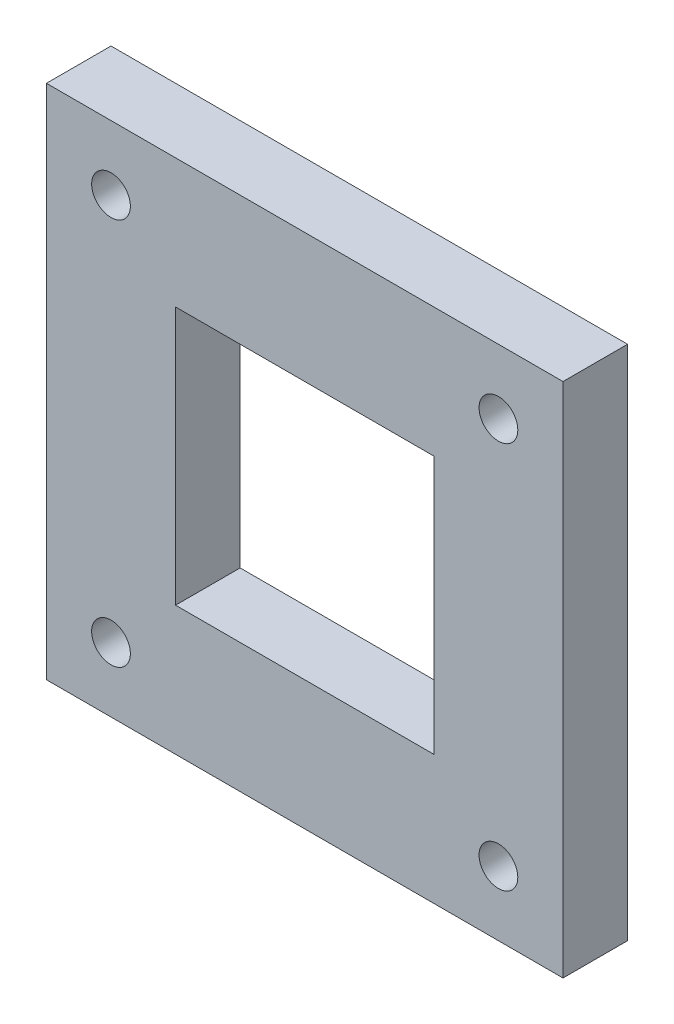
ISO-10303-21;
HEADER;
FILE_DESCRIPTION(('STEP AP214'),'2;1');
FILE_NAME('part.step','',(''),(''),'','','');
FILE_SCHEMA(('AUTOMOTIVE_DESIGN { 1 0 10303 214 1 1 1 1 }'));
ENDSEC;
DATA;
#1=APPLICATION_CONTEXT('core data for automotive mechanical design processes');
#2=APPLICATION_PROTOCOL_DEFINITION('international standard','automotive_design',2000,#1);
#3=PRODUCT_CONTEXT('',#1,'mechanical');
#4=PRODUCT('Part','Part','',(#3));
#5=PRODUCT_RELATED_PRODUCT_CATEGORY('part','',(#4));
#6=PRODUCT_DEFINITION_FORMATION('','',#4);
#7=PRODUCT_DEFINITION_CONTEXT('part definition',#1,'design');
#8=PRODUCT_DEFINITION('design','',#6,#7);
#9=PRODUCT_DEFINITION_SHAPE('','',#8);
#10=(LENGTH_UNIT() NAMED_UNIT(*) SI_UNIT(.MILLI.,.METRE.));
#11=(NAMED_UNIT(*) PLANE_ANGLE_UNIT() SI_UNIT($,.RADIAN.));
#12=(NAMED_UNIT(*) SI_UNIT($,.STERADIAN.) SOLID_ANGLE_UNIT());
#13=UNCERTAINTY_MEASURE_WITH_UNIT(LENGTH_MEASURE(1.E-05),#10,'distance_accuracy_value','');
#14=(GEOMETRIC_REPRESENTATION_CONTEXT(3) GLOBAL_UNCERTAINTY_ASSIGNED_CONTEXT((#13)) GLOBAL_UNIT_ASSIGNED_CONTEXT((#10,
#11,#12)) REPRESENTATION_CONTEXT('',''));
#15=CARTESIAN_POINT('',(0.,0.,0.));
#16=DIRECTION('',(0.,0.,1.));
#17=DIRECTION('',(1.,0.,0.));
#18=AXIS2_PLACEMENT_3D('',#15,#16,#17);
#19=CARTESIAN_POINT('',(20.,0.,5.));
#20=DIRECTION('',(-1.,0.,0.));
#21=DIRECTION('',(0.,0.,1.));
#22=AXIS2_PLACEMENT_3D('',#19,#20,#21);
#23=PLANE('',#22);
#24=DIRECTION('',(0.,1.,0.));
#25=VECTOR('',#24,1.);
#26=CARTESIAN_POINT('',(20.,0.,0.));
#27=LINE('',#26,#25);
#28=CARTESIAN_POINT('',(20.,-20.,0.));
#29=VERTEX_POINT('',#28);
#30=CARTESIAN_POINT('',(20.,20.,0.));
#31=VERTEX_POINT('',#30);
#32=EDGE_CURVE('E175',#29,#31,#27,.T.);
#33=ORIENTED_EDGE('',*,*,#32,.T.);
#34=DIRECTION('',(0.,0.,-1.));
#35=VECTOR('',#34,1.);
#36=CARTESIAN_POINT('',(20.,20.,5.));
#37=LINE('',#36,#35);
#38=CARTESIAN_POINT('',(20.,20.,5.));
#39=VERTEX_POINT('',#38);
#40=EDGE_CURVE('E11',#39,#31,#37,.T.);
#41=ORIENTED_EDGE('',*,*,#40,.F.);
#42=DIRECTION('',(0.,1.,0.));
#43=VECTOR('',#42,1.);
#44=CARTESIAN_POINT('',(20.,-20.,5.));
#45=LINE('',#44,#43);
#46=CARTESIAN_POINT('',(20.,-20.,5.));
#47=VERTEX_POINT('',#46);
#48=EDGE_CURVE('E179',#47,#39,#45,.T.);
#49=ORIENTED_EDGE('',*,*,#48,.F.);
#50=DIRECTION('',(0.,0.,-1.));
#51=VECTOR('',#50,1.);
#52=CARTESIAN_POINT('',(20.,-20.,5.));
#53=LINE('',#52,#51);
#54=EDGE_CURVE('E192',#47,#29,#53,.T.);
#55=ORIENTED_EDGE('',*,*,#54,.T.);
#56=EDGE_LOOP('',(#33,#41,#49,#55));
#57=FACE_BOUND('',#56,.T.);
#58=ADVANCED_FACE('F43',(#57),#23,.F.);
#59=CARTESIAN_POINT('',(20.,20.,5.));
#60=DIRECTION('',(0.,-1.,0.));
#61=DIRECTION('',(1.,0.,0.));
#62=AXIS2_PLACEMENT_3D('',#59,#60,#61);
#63=PLANE('',#62);
#64=DIRECTION('',(-1.,0.,0.));
#65=VECTOR('',#64,1.);
#66=CARTESIAN_POINT('',(20.,20.,0.));
#67=LINE('',#66,#65);
#68=CARTESIAN_POINT('',(-20.,20.,0.));
#69=VERTEX_POINT('',#68);
#70=EDGE_CURVE('E195',#31,#69,#67,.T.);
#71=ORIENTED_EDGE('',*,*,#70,.T.);
#72=DIRECTION('',(0.,0.,-1.));
#73=VECTOR('',#72,1.);
#74=CARTESIAN_POINT('',(-20.,20.,5.));
#75=LINE('',#74,#73);
#76=CARTESIAN_POINT('',(-20.,20.,5.));
#77=VERTEX_POINT('',#76);
#78=EDGE_CURVE('E51',#77,#69,#75,.T.);
#79=ORIENTED_EDGE('',*,*,#78,.F.);
#80=DIRECTION('',(-1.,0.,0.));
#81=VECTOR('',#80,1.);
#82=CARTESIAN_POINT('',(20.,20.,5.));
#83=LINE('',#82,#81);
#84=EDGE_CURVE('E182',#39,#77,#83,.T.);
#85=ORIENTED_EDGE('',*,*,#84,.F.);
#86=ORIENTED_EDGE('',*,*,#40,.T.);
#87=EDGE_LOOP('',(#71,#79,#85,#86));
#88=FACE_BOUND('',#87,.T.);
#89=ADVANCED_FACE('F232',(#88),#63,.F.);
#90=CARTESIAN_POINT('',(-20.,20.,5.));
#91=DIRECTION('',(1.,0.,0.));
#92=DIRECTION('',(0.,1.,0.));
#93=AXIS2_PLACEMENT_3D('',#90,#91,#92);
#94=PLANE('',#93);
#95=DIRECTION('',(0.,-1.,0.));
#96=VECTOR('',#95,1.);
#97=CARTESIAN_POINT('',(-20.,20.,0.));
#98=LINE('',#97,#96);
#99=CARTESIAN_POINT('',(-20.,-20.,0.));
#100=VERTEX_POINT('',#99);
#101=EDGE_CURVE('E198',#69,#100,#98,.T.);
#102=ORIENTED_EDGE('',*,*,#101,.T.);
#103=DIRECTION('',(0.,0.,-1.));
#104=VECTOR('',#103,1.);
#105=CARTESIAN_POINT('',(-20.,-20.,5.));
#106=LINE('',#105,#104);
#107=CARTESIAN_POINT('',(-20.,-20.,5.));
#108=VERTEX_POINT('',#107);
#109=EDGE_CURVE('E207',#108,#100,#106,.T.);
#110=ORIENTED_EDGE('',*,*,#109,.F.);
#111=DIRECTION('',(0.,-1.,0.));
#112=VECTOR('',#111,1.);
#113=CARTESIAN_POINT('',(-20.,20.,5.));
#114=LINE('',#113,#112);
#115=EDGE_CURVE('E186',#77,#108,#114,.T.);
#116=ORIENTED_EDGE('',*,*,#115,.F.);
#117=ORIENTED_EDGE('',*,*,#78,.T.);
#118=EDGE_LOOP('',(#102,#110,#116,#117));
#119=FACE_BOUND('',#118,.T.);
#120=ADVANCED_FACE('F216',(#119),#94,.F.);
#121=CARTESIAN_POINT('',(-20.,-20.,5.));
#122=DIRECTION('',(0.,1.,0.));
#123=DIRECTION('',(0.,0.,1.));
#124=AXIS2_PLACEMENT_3D('',#121,#122,#123);
#125=PLANE('',#124);
#126=DIRECTION('',(1.,0.,0.));
#127=VECTOR('',#126,1.);
#128=CARTESIAN_POINT('',(-20.,-20.,0.));
#129=LINE('',#128,#127);
#130=EDGE_CURVE('E183',#100,#29,#129,.T.);
#131=ORIENTED_EDGE('',*,*,#130,.T.);
#132=ORIENTED_EDGE('',*,*,#54,.F.);
#133=DIRECTION('',(1.,0.,0.));
#134=VECTOR('',#133,1.);
#135=CARTESIAN_POINT('',(-20.,-20.,5.));
#136=LINE('',#135,#134);
#137=EDGE_CURVE('E189',#108,#47,#136,.T.);
#138=ORIENTED_EDGE('',*,*,#137,.F.);
#139=ORIENTED_EDGE('',*,*,#109,.T.);
#140=EDGE_LOOP('',(#131,#132,#138,#139));
#141=FACE_BOUND('',#140,.T.);
#142=ADVANCED_FACE('F226',(#141),#125,.F.);
#143=CARTESIAN_POINT('',(0.,0.,5.));
#144=DIRECTION('',(0.,0.,1.));
#145=DIRECTION('',(1.,0.,0.));
#146=AXIS2_PLACEMENT_3D('',#143,#144,#145);
#147=PLANE('',#146);
#148=CARTESIAN_POINT('',(15.,15.,5.));
#149=DIRECTION('',(0.,0.,1.));
#150=DIRECTION('',(1.,0.,0.));
#151=AXIS2_PLACEMENT_3D('',#148,#149,#150);
#152=CIRCLE('',#151,1.5);
#153=CARTESIAN_POINT('',(16.5,15.,5.));
#154=VERTEX_POINT('',#153);
#155=EDGE_CURVE('E154',#154,#154,#152,.T.);
#156=ORIENTED_EDGE('',*,*,#155,.F.);
#157=EDGE_LOOP('',(#156));
#158=FACE_BOUND('',#157,.T.);
#159=CARTESIAN_POINT('',(-15.,-15.,5.));
#160=DIRECTION('',(0.,0.,1.));
#161=DIRECTION('',(1.,0.,0.));
#162=AXIS2_PLACEMENT_3D('',#159,#160,#161);
#163=CIRCLE('',#162,1.5);
#164=CARTESIAN_POINT('',(-13.5,-15.,5.));
#165=VERTEX_POINT('',#164);
#166=EDGE_CURVE('E163',#165,#165,#163,.T.);
#167=ORIENTED_EDGE('',*,*,#166,.F.);
#168=EDGE_LOOP('',(#167));
#169=FACE_BOUND('',#168,.T.);
#170=CARTESIAN_POINT('',(15.,-15.,5.));
#171=DIRECTION('',(0.,0.,1.));
#172=DIRECTION('',(1.,0.,0.));
#173=AXIS2_PLACEMENT_3D('',#170,#171,#172);
#174=CIRCLE('',#173,1.5);
#175=CARTESIAN_POINT('',(16.5,-15.,5.));
#176=VERTEX_POINT('',#175);
#177=EDGE_CURVE('E137',#176,#176,#174,.T.);
#178=ORIENTED_EDGE('',*,*,#177,.F.);
#179=EDGE_LOOP('',(#178));
#180=FACE_BOUND('',#179,.T.);
#181=DIRECTION('',(-1.,0.,0.));
#182=VECTOR('',#181,1.);
#183=CARTESIAN_POINT('',(10.,10.,5.));
#184=LINE('',#183,#182);
#185=CARTESIAN_POINT('',(10.,10.,5.));
#186=VERTEX_POINT('',#185);
#187=CARTESIAN_POINT('',(-10.,10.,5.));
#188=VERTEX_POINT('',#187);
#189=EDGE_CURVE('E58',#186,#188,#184,.T.);
#190=ORIENTED_EDGE('',*,*,#189,.F.);
#191=DIRECTION('',(0.,1.,0.));
#192=VECTOR('',#191,1.);
#193=CARTESIAN_POINT('',(10.,10.,5.));
#194=LINE('',#193,#192);
#195=CARTESIAN_POINT('',(10.,-10.,5.));
#196=VERTEX_POINT('',#195);
#197=EDGE_CURVE('E118',#196,#186,#194,.T.);
#198=ORIENTED_EDGE('',*,*,#197,.F.);
#199=DIRECTION('',(1.,0.,0.));
#200=VECTOR('',#199,1.);
#201=CARTESIAN_POINT('',(-10.,-10.,5.));
#202=LINE('',#201,#200);
#203=CARTESIAN_POINT('',(-10.,-10.,5.));
#204=VERTEX_POINT('',#203);
#205=EDGE_CURVE('E124',#204,#196,#202,.T.);
#206=ORIENTED_EDGE('',*,*,#205,.F.);
#207=DIRECTION('',(0.,-1.,0.));
#208=VECTOR('',#207,1.);
#209=CARTESIAN_POINT('',(-10.,-10.,5.));
#210=LINE('',#209,#208);
#211=EDGE_CURVE('E130',#188,#204,#210,.T.);
#212=ORIENTED_EDGE('',*,*,#211,.F.);
#213=EDGE_LOOP('',(#190,#198,#206,#212));
#214=FACE_BOUND('',#213,.T.);
#215=CARTESIAN_POINT('',(-15.,15.,5.));
#216=DIRECTION('',(0.,0.,1.));
#217=DIRECTION('',(1.,0.,0.));
#218=AXIS2_PLACEMENT_3D('',#215,#216,#217);
#219=CIRCLE('',#218,1.5);
#220=CARTESIAN_POINT('',(-13.5,15.,5.));
#221=VERTEX_POINT('',#220);
#222=EDGE_CURVE('E158',#221,#221,#219,.T.);
#223=ORIENTED_EDGE('',*,*,#222,.F.);
#224=EDGE_LOOP('',(#223));
#225=FACE_BOUND('',#224,.T.);
#226=ORIENTED_EDGE('',*,*,#48,.T.);
#227=ORIENTED_EDGE('',*,*,#84,.T.);
#228=ORIENTED_EDGE('',*,*,#115,.T.);
#229=ORIENTED_EDGE('',*,*,#137,.T.);
#230=EDGE_LOOP('',(#226,#227,#228,#229));
#231=FACE_BOUND('',#230,.T.);
#232=ADVANCED_FACE('F127',(#158,#169,#180,#214,#225,#231),#147,.T.);
#233=CARTESIAN_POINT('',(0.,0.,0.));
#234=DIRECTION('',(0.,0.,1.));
#235=DIRECTION('',(1.,0.,0.));
#236=AXIS2_PLACEMENT_3D('',#233,#234,#235);
#237=PLANE('',#236);
#238=CARTESIAN_POINT('',(15.,15.,0.));
#239=DIRECTION('',(0.,0.,1.));
#240=DIRECTION('',(1.,0.,0.));
#241=AXIS2_PLACEMENT_3D('',#238,#239,#240);
#242=CIRCLE('',#241,1.5);
#243=CARTESIAN_POINT('',(16.5,15.,0.));
#244=VERTEX_POINT('',#243);
#245=EDGE_CURVE('E159',#244,#244,#242,.T.);
#246=ORIENTED_EDGE('',*,*,#245,.T.);
#247=EDGE_LOOP('',(#246));
#248=FACE_BOUND('',#247,.T.);
#249=CARTESIAN_POINT('',(-15.,-15.,0.));
#250=DIRECTION('',(0.,0.,1.));
#251=DIRECTION('',(1.,0.,0.));
#252=AXIS2_PLACEMENT_3D('',#249,#250,#251);
#253=CIRCLE('',#252,1.5);
#254=CARTESIAN_POINT('',(-13.5,-15.,0.));
#255=VERTEX_POINT('',#254);
#256=EDGE_CURVE('E167',#255,#255,#253,.T.);
#257=ORIENTED_EDGE('',*,*,#256,.T.);
#258=EDGE_LOOP('',(#257));
#259=FACE_BOUND('',#258,.T.);
#260=CARTESIAN_POINT('',(15.,-15.,0.));
#261=DIRECTION('',(0.,0.,1.));
#262=DIRECTION('',(1.,0.,0.));
#263=AXIS2_PLACEMENT_3D('',#260,#261,#262);
#264=CIRCLE('',#263,1.5);
#265=CARTESIAN_POINT('',(16.5,-15.,0.));
#266=VERTEX_POINT('',#265);
#267=EDGE_CURVE('E132',#266,#266,#264,.T.);
#268=ORIENTED_EDGE('',*,*,#267,.T.);
#269=EDGE_LOOP('',(#268));
#270=FACE_BOUND('',#269,.T.);
#271=DIRECTION('',(0.,1.,0.));
#272=VECTOR('',#271,1.);
#273=CARTESIAN_POINT('',(10.,10.,0.));
#274=LINE('',#273,#272);
#275=CARTESIAN_POINT('',(10.,-10.,0.));
#276=VERTEX_POINT('',#275);
#277=CARTESIAN_POINT('',(10.,10.,0.));
#278=VERTEX_POINT('',#277);
#279=EDGE_CURVE('E142',#276,#278,#274,.T.);
#280=ORIENTED_EDGE('',*,*,#279,.T.);
#281=DIRECTION('',(-1.,0.,0.));
#282=VECTOR('',#281,1.);
#283=CARTESIAN_POINT('',(10.,10.,0.));
#284=LINE('',#283,#282);
#285=CARTESIAN_POINT('',(-10.,10.,0.));
#286=VERTEX_POINT('',#285);
#287=EDGE_CURVE('E110',#278,#286,#284,.T.);
#288=ORIENTED_EDGE('',*,*,#287,.T.);
#289=DIRECTION('',(0.,-1.,0.));
#290=VECTOR('',#289,1.);
#291=CARTESIAN_POINT('',(-10.,-10.,0.));
#292=LINE('',#291,#290);
#293=CARTESIAN_POINT('',(-10.,-10.,0.));
#294=VERTEX_POINT('',#293);
#295=EDGE_CURVE('E148',#286,#294,#292,.T.);
#296=ORIENTED_EDGE('',*,*,#295,.T.);
#297=DIRECTION('',(1.,0.,0.));
#298=VECTOR('',#297,1.);
#299=CARTESIAN_POINT('',(-10.,-10.,0.));
#300=LINE('',#299,#298);
#301=EDGE_CURVE('E66',#294,#276,#300,.T.);
#302=ORIENTED_EDGE('',*,*,#301,.T.);
#303=EDGE_LOOP('',(#280,#288,#296,#302));
#304=FACE_BOUND('',#303,.T.);
#305=CARTESIAN_POINT('',(-15.,15.,0.));
#306=DIRECTION('',(0.,0.,1.));
#307=DIRECTION('',(1.,0.,0.));
#308=AXIS2_PLACEMENT_3D('',#305,#306,#307);
#309=CIRCLE('',#308,1.5);
#310=CARTESIAN_POINT('',(-13.5,15.,0.));
#311=VERTEX_POINT('',#310);
#312=EDGE_CURVE('E171',#311,#311,#309,.T.);
#313=ORIENTED_EDGE('',*,*,#312,.T.);
#314=EDGE_LOOP('',(#313));
#315=FACE_BOUND('',#314,.T.);
#316=ORIENTED_EDGE('',*,*,#32,.F.);
#317=ORIENTED_EDGE('',*,*,#130,.F.);
#318=ORIENTED_EDGE('',*,*,#101,.F.);
#319=ORIENTED_EDGE('',*,*,#70,.F.);
#320=EDGE_LOOP('',(#316,#317,#318,#319));
#321=FACE_BOUND('',#320,.T.);
#322=ADVANCED_FACE('F223',(#248,#259,#270,#304,#315,#321),#237,.F.);
#323=CARTESIAN_POINT('',(-15.,15.,0.));
#324=DIRECTION('',(0.,0.,1.));
#325=DIRECTION('',(1.,0.,0.));
#326=AXIS2_PLACEMENT_3D('',#323,#324,#325);
#327=CYLINDRICAL_SURFACE('',#326,1.5);
#328=ORIENTED_EDGE('',*,*,#312,.F.);
#329=EDGE_LOOP('',(#328));
#330=FACE_BOUND('',#329,.T.);
#331=ORIENTED_EDGE('',*,*,#222,.T.);
#332=EDGE_LOOP('',(#331));
#333=FACE_BOUND('',#332,.T.);
#334=ADVANCED_FACE('F244',(#330,#333),#327,.F.);
#335=CARTESIAN_POINT('',(10.,10.,0.));
#336=DIRECTION('',(0.,1.,0.));
#337=DIRECTION('',(-1.,0.,0.));
#338=AXIS2_PLACEMENT_3D('',#335,#336,#337);
#339=PLANE('',#338);
#340=ORIENTED_EDGE('',*,*,#189,.T.);
#341=DIRECTION('',(0.,0.,1.));
#342=VECTOR('',#341,1.);
#343=CARTESIAN_POINT('',(-10.,10.,0.));
#344=LINE('',#343,#342);
#345=EDGE_CURVE('E145',#286,#188,#344,.T.);
#346=ORIENTED_EDGE('',*,*,#345,.F.);
#347=ORIENTED_EDGE('',*,*,#287,.F.);
#348=DIRECTION('',(0.,0.,1.));
#349=VECTOR('',#348,1.);
#350=CARTESIAN_POINT('',(10.,10.,0.));
#351=LINE('',#350,#349);
#352=EDGE_CURVE('E106',#278,#186,#351,.T.);
#353=ORIENTED_EDGE('',*,*,#352,.T.);
#354=EDGE_LOOP('',(#340,#346,#347,#353));
#355=FACE_BOUND('',#354,.T.);
#356=ADVANCED_FACE('F108',(#355),#339,.F.);
#357=CARTESIAN_POINT('',(10.,10.,0.));
#358=DIRECTION('',(1.,0.,0.));
#359=DIRECTION('',(0.,0.,-1.));
#360=AXIS2_PLACEMENT_3D('',#357,#358,#359);
#361=PLANE('',#360);
#362=ORIENTED_EDGE('',*,*,#197,.T.);
#363=ORIENTED_EDGE('',*,*,#352,.F.);
#364=ORIENTED_EDGE('',*,*,#279,.F.);
#365=DIRECTION('',(0.,0.,1.));
#366=VECTOR('',#365,1.);
#367=CARTESIAN_POINT('',(10.,-10.,0.));
#368=LINE('',#367,#366);
#369=EDGE_CURVE('E115',#276,#196,#368,.T.);
#370=ORIENTED_EDGE('',*,*,#369,.T.);
#371=EDGE_LOOP('',(#362,#363,#364,#370));
#372=FACE_BOUND('',#371,.T.);
#373=ADVANCED_FACE('F119',(#372),#361,.F.);
#374=CARTESIAN_POINT('',(-10.,-10.,0.));
#375=DIRECTION('',(0.,-1.,0.));
#376=DIRECTION('',(1.,0.,0.));
#377=AXIS2_PLACEMENT_3D('',#374,#375,#376);
#378=PLANE('',#377);
#379=ORIENTED_EDGE('',*,*,#205,.T.);
#380=ORIENTED_EDGE('',*,*,#369,.F.);
#381=ORIENTED_EDGE('',*,*,#301,.F.);
#382=DIRECTION('',(0.,0.,1.));
#383=VECTOR('',#382,1.);
#384=CARTESIAN_POINT('',(-10.,-10.,0.));
#385=LINE('',#384,#383);
#386=EDGE_CURVE('E286',#294,#204,#385,.T.);
#387=ORIENTED_EDGE('',*,*,#386,.T.);
#388=EDGE_LOOP('',(#379,#380,#381,#387));
#389=FACE_BOUND('',#388,.T.);
#390=ADVANCED_FACE('F263',(#389),#378,.F.);
#391=CARTESIAN_POINT('',(-10.,-10.,0.));
#392=DIRECTION('',(-1.,0.,0.));
#393=DIRECTION('',(0.,-1.,0.));
#394=AXIS2_PLACEMENT_3D('',#391,#392,#393);
#395=PLANE('',#394);
#396=ORIENTED_EDGE('',*,*,#211,.T.);
#397=ORIENTED_EDGE('',*,*,#386,.F.);
#398=ORIENTED_EDGE('',*,*,#295,.F.);
#399=ORIENTED_EDGE('',*,*,#345,.T.);
#400=EDGE_LOOP('',(#396,#397,#398,#399));
#401=FACE_BOUND('',#400,.T.);
#402=ADVANCED_FACE('F266',(#401),#395,.F.);
#403=CARTESIAN_POINT('',(15.,-15.,0.));
#404=DIRECTION('',(0.,0.,1.));
#405=DIRECTION('',(1.,0.,0.));
#406=AXIS2_PLACEMENT_3D('',#403,#404,#405);
#407=CYLINDRICAL_SURFACE('',#406,1.5);
#408=ORIENTED_EDGE('',*,*,#267,.F.);
#409=EDGE_LOOP('',(#408));
#410=FACE_BOUND('',#409,.T.);
#411=ORIENTED_EDGE('',*,*,#177,.T.);
#412=EDGE_LOOP('',(#411));
#413=FACE_BOUND('',#412,.T.);
#414=ADVANCED_FACE('F256',(#410,#413),#407,.F.);
#415=CARTESIAN_POINT('',(-15.,-15.,0.));
#416=DIRECTION('',(0.,0.,1.));
#417=DIRECTION('',(1.,0.,0.));
#418=AXIS2_PLACEMENT_3D('',#415,#416,#417);
#419=CYLINDRICAL_SURFACE('',#418,1.5);
#420=ORIENTED_EDGE('',*,*,#256,.F.);
#421=EDGE_LOOP('',(#420));
#422=FACE_BOUND('',#421,.T.);
#423=ORIENTED_EDGE('',*,*,#166,.T.);
#424=EDGE_LOOP('',(#423));
#425=FACE_BOUND('',#424,.T.);
#426=ADVANCED_FACE('F252',(#422,#425),#419,.F.);
#427=CARTESIAN_POINT('',(15.,15.,0.));
#428=DIRECTION('',(0.,0.,1.));
#429=DIRECTION('',(1.,0.,0.));
#430=AXIS2_PLACEMENT_3D('',#427,#428,#429);
#431=CYLINDRICAL_SURFACE('',#430,1.5);
#432=ORIENTED_EDGE('',*,*,#245,.F.);
#433=EDGE_LOOP('',(#432));
#434=FACE_BOUND('',#433,.T.);
#435=ORIENTED_EDGE('',*,*,#155,.T.);
#436=EDGE_LOOP('',(#435));
#437=FACE_BOUND('',#436,.T.);
#438=ADVANCED_FACE('F255',(#434,#437),#431,.F.);
#439=CLOSED_SHELL('',(#58,#89,#120,#142,#232,#322,#334,#356,#373,#390,#402,#414,#426,#438));
#440=MANIFOLD_SOLID_BREP('B2',#439);
#441=ADVANCED_BREP_SHAPE_REPRESENTATION('',(#18,#440),#14);
#442=SHAPE_DEFINITION_REPRESENTATION(#9,#441);
ENDSEC;
END-ISO-10303-21;
